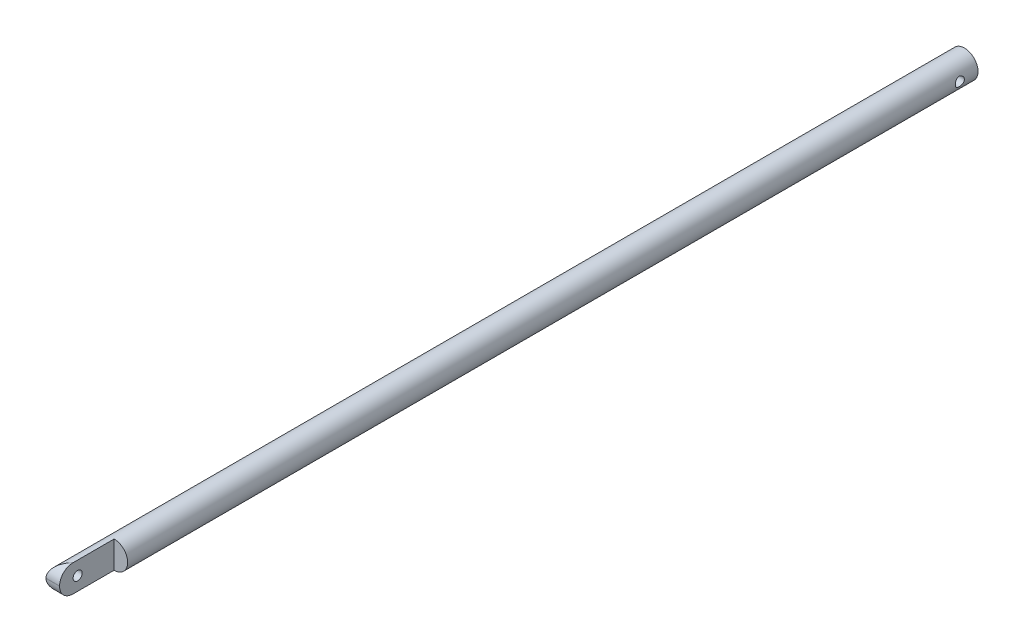
ISO-10303-21;
HEADER;
FILE_DESCRIPTION(('STEP AP214'),'2;1');
FILE_NAME('part.step','',(''),(''),'','','');
FILE_SCHEMA(('AUTOMOTIVE_DESIGN { 1 0 10303 214 1 1 1 1 }'));
ENDSEC;
DATA;
#1=APPLICATION_CONTEXT('core data for automotive mechanical design processes');
#2=APPLICATION_PROTOCOL_DEFINITION('international standard','automotive_design',2000,#1);
#3=PRODUCT_CONTEXT('',#1,'mechanical');
#4=PRODUCT('Part','Part','',(#3));
#5=PRODUCT_RELATED_PRODUCT_CATEGORY('part','',(#4));
#6=PRODUCT_DEFINITION_FORMATION('','',#4);
#7=PRODUCT_DEFINITION_CONTEXT('part definition',#1,'design');
#8=PRODUCT_DEFINITION('design','',#6,#7);
#9=PRODUCT_DEFINITION_SHAPE('','',#8);
#10=(LENGTH_UNIT() NAMED_UNIT(*) SI_UNIT(.MILLI.,.METRE.));
#11=(NAMED_UNIT(*) PLANE_ANGLE_UNIT() SI_UNIT($,.RADIAN.));
#12=(NAMED_UNIT(*) SI_UNIT($,.STERADIAN.) SOLID_ANGLE_UNIT());
#13=UNCERTAINTY_MEASURE_WITH_UNIT(LENGTH_MEASURE(1.E-05),#10,'distance_accuracy_value','');
#14=(GEOMETRIC_REPRESENTATION_CONTEXT(3) GLOBAL_UNCERTAINTY_ASSIGNED_CONTEXT((#13)) GLOBAL_UNIT_ASSIGNED_CONTEXT((#10,
#11,#12)) REPRESENTATION_CONTEXT('',''));
#15=CARTESIAN_POINT('',(0.,0.,0.));
#16=DIRECTION('',(0.,0.,1.));
#17=DIRECTION('',(1.,0.,0.));
#18=AXIS2_PLACEMENT_3D('',#15,#16,#17);
#19=CARTESIAN_POINT('',(0.,0.,100.));
#20=DIRECTION('',(0.,0.,-1.));
#21=DIRECTION('',(-1.,0.,0.));
#22=AXIS2_PLACEMENT_3D('',#19,#20,#21);
#23=CYLINDRICAL_SURFACE('',#22,1.49);
#24=DIRECTION('',(0.,0.,1.));
#25=VECTOR('',#24,1.);
#26=CARTESIAN_POINT('',(0.,-1.49,100.));
#27=LINE('',#26,#25);
#28=CARTESIAN_POINT('',(0.,-1.49,94.));
#29=VERTEX_POINT('',#28);
#30=CARTESIAN_POINT('',(0.,-1.49,98.52));
#31=VERTEX_POINT('',#30);
#32=EDGE_CURVE('E105',#29,#31,#27,.T.);
#33=ORIENTED_EDGE('',*,*,#32,.T.);
#34=CARTESIAN_POINT('',(-1.48996644257513,-0.00999999999999985,100.));
#35=CARTESIAN_POINT('',(-1.48975098299897,-0.0433436972343967,100.000008302624));
#36=CARTESIAN_POINT('',(-1.48839991396683,-0.0766731342420869,99.9988734636431));
#37=CARTESIAN_POINT('',(-1.48349288609919,-0.142992967281033,99.9943846454721));
#38=CARTESIAN_POINT('',(-1.4799386835771,-0.175983612118146,99.9910324338034));
#39=CARTESIAN_POINT('',(-1.47073060528688,-0.241090495511034,99.9822135868565));
#40=CARTESIAN_POINT('',(-1.46509489654836,-0.273211792065162,99.9767652297221));
#41=CARTESIAN_POINT('',(-1.45183776552271,-0.336627404318265,99.9638708596404));
#42=CARTESIAN_POINT('',(-1.44421605115293,-0.367921597628563,99.9564245528493));
#43=CARTESIAN_POINT('',(-1.4186212850257,-0.460062860291223,99.9313384769267));
#44=CARTESIAN_POINT('',(-1.39788132053261,-0.519421624716527,99.9109157406564));
#45=CARTESIAN_POINT('',(-1.35024952062673,-0.633043979274914,99.863882559712));
#46=CARTESIAN_POINT('',(-1.32334373403256,-0.68729561484362,99.8372580802966));
#47=CARTESIAN_POINT('',(-1.25250196174258,-0.811373950170656,99.7670596203769));
#48=CARTESIAN_POINT('',(-1.20611618327293,-0.878411218186854,99.7210213576058));
#49=CARTESIAN_POINT('',(-1.10638789231064,-1.00114324966523,99.6219457019274));
#50=CARTESIAN_POINT('',(-1.05303214725023,-1.05681590858126,99.5688949934698));
#51=CARTESIAN_POINT('',(-0.919924202873167,-1.17672030328409,99.4364786217357));
#52=CARTESIAN_POINT('',(-0.83793177575015,-1.23596314070041,99.3548587504978));
#53=CARTESIAN_POINT('',(-0.668399855263155,-1.33529434396866,99.1860360763111));
#54=CARTESIAN_POINT('',(-0.580854087858026,-1.37536059176952,99.0988269575602));
#55=CARTESIAN_POINT('',(-0.412246912463118,-1.43431082096782,98.9308375242697));
#56=CARTESIAN_POINT('',(-0.331492440316898,-1.4550009898949,98.8503662377716));
#57=CARTESIAN_POINT('',(-0.168957227139915,-1.48267669503932,98.6883891900097));
#58=CARTESIAN_POINT('',(-0.0871789336040764,-1.48969028167084,98.6068858918951));
#59=CARTESIAN_POINT('',(-0.00364537734931286,-1.48999665143288,98.5236331239359));
#60=CARTESIAN_POINT('',(-0.00182266821275024,-1.48999999564511,98.5218165415699));
#61=CARTESIAN_POINT('',(0.,-1.49,98.52));
#62=B_SPLINE_CURVE_WITH_KNOTS('',3,(#34,#35,#36,#37,#38,#39,#40,#41,#42,#43,#44,#45,#46,#47,#48,
#49,#50,#51,#52,#53,#54,#55,#56,#57,#58,#59,#60,#61),.UNSPECIFIED.,.F.,.F.,(4,2,2,2,2,2,2,2,2,2,
2,2,2,4),(0.,0.0999840628176792,0.199888521782604,0.298940878498051,0.398007811113156,
0.595377356559186,0.79319797106562,1.07250348405052,1.35234718525515,1.74019184185946,
2.12848276228958,2.47527570196086,2.82135662458945,2.82907673473602),.UNSPECIFIED.);
#63=CARTESIAN_POINT('',(-1.48996644257513,-0.0100000000000002,100.));
#64=VERTEX_POINT('',#63);
#65=EDGE_CURVE('E57',#31,#64,#62,.F.);
#66=ORIENTED_EDGE('',*,*,#65,.T.);
#67=CARTESIAN_POINT('',(0.,0.,100.));
#68=DIRECTION('',(0.,0.,1.));
#69=DIRECTION('',(1.,0.,0.));
#70=AXIS2_PLACEMENT_3D('',#67,#68,#69);
#71=CIRCLE('',#70,1.49);
#72=CARTESIAN_POINT('',(-1.48996644257513,0.00999999999999733,100.));
#73=VERTEX_POINT('',#72);
#74=EDGE_CURVE('E96',#73,#64,#71,.T.);
#75=ORIENTED_EDGE('',*,*,#74,.F.);
#76=CARTESIAN_POINT('',(-1.48996644257513,0.00999999999999769,100.));
#77=CARTESIAN_POINT('',(-1.48975098299897,0.0433436972343947,100.000008302624));
#78=CARTESIAN_POINT('',(-1.48839991396683,0.076673134242085,99.9988734636431));
#79=CARTESIAN_POINT('',(-1.48349288609919,0.142992967281031,99.9943846454721));
#80=CARTESIAN_POINT('',(-1.4799386835771,0.175983612118144,99.9910324338034));
#81=CARTESIAN_POINT('',(-1.47073060528688,0.241090495511032,99.9822135868565));
#82=CARTESIAN_POINT('',(-1.46509489654836,0.273211792065161,99.9767652297221));
#83=CARTESIAN_POINT('',(-1.45183776552271,0.336627404318263,99.9638708596404));
#84=CARTESIAN_POINT('',(-1.44421605115293,0.367921597628561,99.9564245528493));
#85=CARTESIAN_POINT('',(-1.4186212850257,0.46006286029122,99.9313384769267));
#86=CARTESIAN_POINT('',(-1.39788132053261,0.519421624716526,99.9109157406564));
#87=CARTESIAN_POINT('',(-1.35024952062673,0.633043979274912,99.863882559712));
#88=CARTESIAN_POINT('',(-1.32334373403256,0.687295614843617,99.8372580802966));
#89=CARTESIAN_POINT('',(-1.25250196174258,0.811373950170654,99.7670596203769));
#90=CARTESIAN_POINT('',(-1.20611618327292,0.878411218186857,99.7210213576058));
#91=CARTESIAN_POINT('',(-1.10638789231064,1.00114324966523,99.6219457019274));
#92=CARTESIAN_POINT('',(-1.05303214725025,1.05681590858126,99.5688949934698));
#93=CARTESIAN_POINT('',(-0.919924202873138,1.17672030328409,99.4364786217357));
#94=CARTESIAN_POINT('',(-0.837931775750019,1.23596314070042,99.3548587504979));
#95=CARTESIAN_POINT('',(-0.668399855263281,1.33529434396866,99.1860360763109));
#96=CARTESIAN_POINT('',(-0.580854087858513,1.37536059176952,99.0988269575597));
#97=CARTESIAN_POINT('',(-0.412246912462684,1.43431082096782,98.9308375242701));
#98=CARTESIAN_POINT('',(-0.331492440315354,1.4550009898949,98.8503662377731));
#99=CARTESIAN_POINT('',(-0.168957227141483,1.48267669503932,98.6883891900082));
#100=CARTESIAN_POINT('',(-0.0871789336098552,1.48969028167084,98.6068858918893));
#101=CARTESIAN_POINT('',(-0.00364537734957831,1.48999665143288,98.5236331239357));
#102=CARTESIAN_POINT('',(-0.00182266821288542,1.48999999564511,98.5218165415698));
#103=CARTESIAN_POINT('',(0.,1.49,98.52));
#104=B_SPLINE_CURVE_WITH_KNOTS('',3,(#76,#77,#78,#79,#80,#81,#82,#83,#84,#85,#86,#87,#88,#89,
#90,#91,#92,#93,#94,#95,#96,#97,#98,#99,#100,#101,#102,#103),.UNSPECIFIED.,.F.,.F.,(4,2,2,2,2,2,
2,2,2,2,2,2,2,4),(0.,0.0999840628176796,0.199888521782604,0.298940878498051,0.398007811113156,
0.595377356559186,0.793197971065625,1.07250348405053,1.35234718525516,1.74019184185947,
2.12848276228959,2.47527570196085,2.82135662458943,2.82907673473602),.UNSPECIFIED.);
#105=CARTESIAN_POINT('',(0.,1.49,98.52));
#106=VERTEX_POINT('',#105);
#107=EDGE_CURVE('E166',#73,#106,#104,.T.);
#108=ORIENTED_EDGE('',*,*,#107,.T.);
#109=DIRECTION('',(0.,0.,1.));
#110=VECTOR('',#109,1.);
#111=CARTESIAN_POINT('',(0.,1.49,100.));
#112=LINE('',#111,#110);
#113=CARTESIAN_POINT('',(0.,1.49,94.));
#114=VERTEX_POINT('',#113);
#115=EDGE_CURVE('E111',#114,#106,#112,.T.);
#116=ORIENTED_EDGE('',*,*,#115,.F.);
#117=CARTESIAN_POINT('',(0.,0.,94.));
#118=DIRECTION('',(0.,0.,-1.));
#119=DIRECTION('',(-1.,0.,0.));
#120=AXIS2_PLACEMENT_3D('',#117,#118,#119);
#121=CIRCLE('',#120,1.49);
#122=EDGE_CURVE('E11',#114,#29,#121,.T.);
#123=ORIENTED_EDGE('',*,*,#122,.T.);
#124=EDGE_LOOP('',(#33,#66,#75,#108,#116,#123));
#125=FACE_BOUND('',#124,.T.);
#126=CARTESIAN_POINT('',(-1.49,0.,2.));
#127=CARTESIAN_POINT('',(-1.49000010328991,0.0272712791740718,1.99999983628463));
#128=CARTESIAN_POINT('',(-1.48924440153776,0.0545414979399945,2.00223841327082));
#129=CARTESIAN_POINT('',(-1.48630425140027,0.108278077470845,2.01110572681788));
#130=CARTESIAN_POINT('',(-1.48411967368715,0.134744365244943,2.01773486076933));
#131=CARTESIAN_POINT('',(-1.47855899787541,0.186090621253429,2.03513003136166));
#132=CARTESIAN_POINT('',(-1.47518490842495,0.21097318071568,2.04588909676971));
#133=CARTESIAN_POINT('',(-1.4675891719475,0.258580556650836,2.07120700818237));
#134=CARTESIAN_POINT('',(-1.46336735426352,0.28130493729976,2.08576661945578));
#135=CARTESIAN_POINT('',(-1.45435457808162,0.324747230286621,2.11880802865111));
#136=CARTESIAN_POINT('',(-1.44954985403106,0.345379087084158,2.13739919369083));
#137=CARTESIAN_POINT('',(-1.43998809693041,0.383298091304435,2.17774347094495));
#138=CARTESIAN_POINT('',(-1.43523107479877,0.400584488841864,2.19949729015968));
#139=CARTESIAN_POINT('',(-1.42615143086999,0.431815906482383,2.24632744983905));
#140=CARTESIAN_POINT('',(-1.4218455576492,0.445648570057964,2.27148228296438));
#141=CARTESIAN_POINT('',(-1.4143652892813,0.468850217401379,2.32392907639742));
#142=CARTESIAN_POINT('',(-1.41119054360571,0.478220584307141,2.35122037142728));
#143=CARTESIAN_POINT('',(-1.40647705001541,0.491907942067121,2.40618611263394));
#144=CARTESIAN_POINT('',(-1.40488620898134,0.496386348448487,2.43381576315859));
#145=CARTESIAN_POINT('',(-1.40336664138944,0.500667279377964,2.48947658681981));
#146=CARTESIAN_POINT('',(-1.40343739299196,0.500471271971788,2.51750763113078));
#147=CARTESIAN_POINT('',(-1.40518740435821,0.495534169464834,2.57179402936628));
#148=CARTESIAN_POINT('',(-1.40679188491689,0.491004366111104,2.5980714296447));
#149=CARTESIAN_POINT('',(-1.41130610896407,0.47787317957604,2.64946907516433));
#150=CARTESIAN_POINT('',(-1.41421601070032,0.469271302756649,2.67458917970684));
#151=CARTESIAN_POINT('',(-1.4210660539239,0.448103006348791,2.72343665940683));
#152=CARTESIAN_POINT('',(-1.42502217997329,0.435474388837752,2.7471347421311));
#153=CARTESIAN_POINT('',(-1.43351228961077,0.406654274709062,2.79214191626118));
#154=CARTESIAN_POINT('',(-1.43804644174384,0.390461737893833,2.81345030744349));
#155=CARTESIAN_POINT('',(-1.44747526028931,0.353961109207902,2.85425965787299));
#156=CARTESIAN_POINT('',(-1.45237630268226,0.333480480967077,2.87360514279225));
#157=CARTESIAN_POINT('',(-1.46177681515474,0.289505558754766,2.90862781120439));
#158=CARTESIAN_POINT('',(-1.46627624564835,0.266010968259399,2.92430463333256));
#159=CARTESIAN_POINT('',(-1.47442702746644,0.216341917244808,2.95167240326501));
#160=CARTESIAN_POINT('',(-1.47806928618575,0.190142627150065,2.96332118289617));
#161=CARTESIAN_POINT('',(-1.48402926963735,0.136004803872141,2.98199773351539));
#162=CARTESIAN_POINT('',(-1.4863474609046,0.108066887146301,2.98902713227315));
#163=CARTESIAN_POINT('',(-1.48932058461056,0.0525606780569667,2.99798875430522));
#164=CARTESIAN_POINT('',(-1.4900440111033,0.0250299224410379,3.00013102652991));
#165=CARTESIAN_POINT('',(-1.4899518385133,-0.0300034936362861,2.99985660523771));
#166=CARTESIAN_POINT('',(-1.48913650317494,-0.0575061581041101,2.99744069299542));
#167=CARTESIAN_POINT('',(-1.48610363699289,-0.110858597983628,2.98828438913505));
#168=CARTESIAN_POINT('',(-1.48392808093254,-0.136733197224387,2.98167336554805));
#169=CARTESIAN_POINT('',(-1.47843582505159,-0.186995220974407,2.96447668139141));
#170=CARTESIAN_POINT('',(-1.4751189793498,-0.211382454897262,2.95389051269754));
#171=CARTESIAN_POINT('',(-1.46757108431293,-0.258697971137434,2.92873335415114));
#172=CARTESIAN_POINT('',(-1.46331813987176,-0.281570472885884,2.91406421011183));
#173=CARTESIAN_POINT('',(-1.45437968596127,-0.324597323735366,2.881272575541));
#174=CARTESIAN_POINT('',(-1.44969404304575,-0.344750829537892,2.86314901780648));
#175=CARTESIAN_POINT('',(-1.44014437423253,-0.382734388178813,2.82297545272353));
#176=CARTESIAN_POINT('',(-1.43528207821155,-0.400414575970997,2.80078299372242));
#177=CARTESIAN_POINT('',(-1.42614890345811,-0.431819007339464,2.75364217057607));
#178=CARTESIAN_POINT('',(-1.42187803153918,-0.445543205342555,2.72869377468689));
#179=CARTESIAN_POINT('',(-1.41445213053474,-0.468585455710087,2.67673044131429));
#180=CARTESIAN_POINT('',(-1.41129511890296,-0.477911346635394,2.64971928066767));
#181=CARTESIAN_POINT('',(-1.40650261472902,-0.49183910433744,2.59437919045322));
#182=CARTESIAN_POINT('',(-1.40486642452427,-0.496443137322599,2.56605087138826));
#183=CARTESIAN_POINT('',(-1.40338086715801,-0.500626163459951,2.51046706191328));
#184=CARTESIAN_POINT('',(-1.40344292885304,-0.500454236044088,2.48323247766306));
#185=CARTESIAN_POINT('',(-1.40512747904943,-0.495704521019355,2.4292019426707));
#186=CARTESIAN_POINT('',(-1.40674987227537,-0.491127002420299,2.40240596524838));
#187=CARTESIAN_POINT('',(-1.41130590786776,-0.477873344634468,2.35053414693942));
#188=CARTESIAN_POINT('',(-1.41421334761914,-0.469278920001822,2.32543494453842));
#189=CARTESIAN_POINT('',(-1.42100189547432,-0.448301880528059,2.2770157193149));
#190=CARTESIAN_POINT('',(-1.42488322148709,-0.435918417745902,2.25369609620173));
#191=CARTESIAN_POINT('',(-1.43339567974663,-0.407077481819681,2.2083826669073));
#192=CARTESIAN_POINT('',(-1.43805233764558,-0.390464372395735,2.18649274492217));
#193=CARTESIAN_POINT('',(-1.44748489716174,-0.35389768082118,2.14573099470454));
#194=CARTESIAN_POINT('',(-1.45226083237488,-0.33394314827934,2.12686002813918));
#195=CARTESIAN_POINT('',(-1.46162145441099,-0.290308968608991,2.09191628284473));
#196=CARTESIAN_POINT('',(-1.4661910212257,-0.266512884032293,2.07598433559481));
#197=CARTESIAN_POINT('',(-1.47441552151367,-0.216429308719879,2.04836342823734));
#198=CARTESIAN_POINT('',(-1.47807067427932,-0.190142417411912,2.03667345052813));
#199=CARTESIAN_POINT('',(-1.4839284145504,-0.136909000046836,2.01831929380489));
#200=CARTESIAN_POINT('',(-1.48618353400992,-0.110031581411885,2.01147180798678));
#201=CARTESIAN_POINT('',(-1.48921906370376,-0.0554355817398468,2.00231289188839));
#202=CARTESIAN_POINT('',(-1.48999989502101,-0.0277172431833341,2.00000016639259));
#203=CARTESIAN_POINT('',(-1.49,0.,2.));
#204=B_SPLINE_CURVE_WITH_KNOTS('',3,(#126,#127,#128,#129,#130,#131,#132,#133,#134,#135,#136,
#137,#138,#139,#140,#141,#142,#143,#144,#145,#146,#147,#148,#149,#150,#151,#152,#153,#154,#155,
#156,#157,#158,#159,#160,#161,#162,#163,#164,#165,#166,#167,#168,#169,#170,#171,#172,#173,#174,
#175,#176,#177,#178,#179,#180,#181,#182,#183,#184,#185,#186,#187,#188,#189,#190,#191,#192,#193,
#194,#195,#196,#197,#198,#199,#200,#201,#202,#203),.UNSPECIFIED.,.T.,.F.,(4,2,2,2,2,2,2,2,2,2,2,
2,2,2,2,2,2,2,2,2,2,2,2,2,2,2,2,2,2,2,2,2,2,2,2,2,2,2,4),(0.,0.0817118272235162,
0.163431051219379,0.245012937283682,0.326611263169847,0.410787135766958,0.49498185460364,
0.581636011888748,0.668263292254159,0.751936751908595,0.835583933434636,0.915350294839791,
0.995126328417926,1.07619970837021,1.15729678258258,1.24268851392295,1.32808865284519,
1.41435751739667,1.5005959663462,1.58305181820848,1.66549353838933,1.74550888576446,
1.8255344646112,1.90768050072293,1.9898519562014,2.07581001104021,2.16176905608036,
2.24757432254128,2.33334020718494,2.41464198948884,2.49593880773932,2.5756493715034,
2.65537778659323,2.73862371972265,2.82189337059319,2.90846884754177,2.99502354223821,
3.07809532369764,3.16114337478657),.UNSPECIFIED.);
#205=CARTESIAN_POINT('',(-1.49,0.,2.));
#206=VERTEX_POINT('',#205);
#207=EDGE_CURVE('E50',#206,#206,#204,.T.);
#208=ORIENTED_EDGE('',*,*,#207,.T.);
#209=EDGE_LOOP('',(#208));
#210=FACE_BOUND('',#209,.T.);
#211=CARTESIAN_POINT('',(1.49,0.,2.));
#212=CARTESIAN_POINT('',(1.49000010328991,-0.0272712791740726,1.99999983628462));
#213=CARTESIAN_POINT('',(1.48924440153776,-0.0545414979399952,2.00223841327082));
#214=CARTESIAN_POINT('',(1.48630425140027,-0.108278077470846,2.01110572681788));
#215=CARTESIAN_POINT('',(1.48411967368715,-0.134744365244944,2.01773486076933));
#216=CARTESIAN_POINT('',(1.47855899787541,-0.186090621253429,2.03513003136166));
#217=CARTESIAN_POINT('',(1.47518490842495,-0.210973180715681,2.04588909676971));
#218=CARTESIAN_POINT('',(1.4675891719475,-0.258580556650837,2.07120700818237));
#219=CARTESIAN_POINT('',(1.46336735426352,-0.281304937299761,2.08576661945578));
#220=CARTESIAN_POINT('',(1.45435457808162,-0.324747230286622,2.11880802865111));
#221=CARTESIAN_POINT('',(1.44954985403106,-0.345379087084159,2.13739919369083));
#222=CARTESIAN_POINT('',(1.43998809693041,-0.383298091304436,2.17774347094495));
#223=CARTESIAN_POINT('',(1.43523107479877,-0.400584488841865,2.19949729015968));
#224=CARTESIAN_POINT('',(1.42615143086999,-0.431815906482384,2.24632744983905));
#225=CARTESIAN_POINT('',(1.4218455576492,-0.445648570057965,2.27148228296438));
#226=CARTESIAN_POINT('',(1.4143652892813,-0.46885021740138,2.32392907639742));
#227=CARTESIAN_POINT('',(1.41119054360571,-0.478220584307142,2.35122037142728));
#228=CARTESIAN_POINT('',(1.40647705001541,-0.491907942067123,2.40618611263394));
#229=CARTESIAN_POINT('',(1.40488620898134,-0.496386348448489,2.43381576315859));
#230=CARTESIAN_POINT('',(1.40336664138944,-0.500667279377965,2.48947658681981));
#231=CARTESIAN_POINT('',(1.40343739299196,-0.50047127197179,2.51750763113078));
#232=CARTESIAN_POINT('',(1.4051874043582,-0.495534169464836,2.57179402936628));
#233=CARTESIAN_POINT('',(1.40679188491689,-0.491004366111105,2.5980714296447));
#234=CARTESIAN_POINT('',(1.41130610896407,-0.477873179576042,2.64946907516433));
#235=CARTESIAN_POINT('',(1.41421601070032,-0.469271302756651,2.67458917970684));
#236=CARTESIAN_POINT('',(1.4210660539239,-0.448103006348793,2.72343665940683));
#237=CARTESIAN_POINT('',(1.42502217997329,-0.435474388837754,2.7471347421311));
#238=CARTESIAN_POINT('',(1.43351228961077,-0.406654274709064,2.79214191626118));
#239=CARTESIAN_POINT('',(1.43804644174384,-0.390461737893835,2.81345030744349));
#240=CARTESIAN_POINT('',(1.44747526028931,-0.353961109207904,2.85425965787299));
#241=CARTESIAN_POINT('',(1.45237630268226,-0.33348048096708,2.87360514279225));
#242=CARTESIAN_POINT('',(1.46177681515474,-0.289505558754769,2.90862781120439));
#243=CARTESIAN_POINT('',(1.46627624564835,-0.266010968259402,2.92430463333256));
#244=CARTESIAN_POINT('',(1.47442702746644,-0.21634191724481,2.95167240326501));
#245=CARTESIAN_POINT('',(1.47806928618575,-0.190142627150068,2.96332118289617));
#246=CARTESIAN_POINT('',(1.48402926963735,-0.136004803872143,2.98199773351539));
#247=CARTESIAN_POINT('',(1.4863474609046,-0.108066887146304,2.98902713227315));
#248=CARTESIAN_POINT('',(1.48932058461056,-0.0525606780569693,2.99798875430522));
#249=CARTESIAN_POINT('',(1.4900440111033,-0.0250299224410405,3.00013102652991));
#250=CARTESIAN_POINT('',(1.4899518385133,0.0300034936362835,2.99985660523771));
#251=CARTESIAN_POINT('',(1.48913650317494,0.0575061581041077,2.99744069299542));
#252=CARTESIAN_POINT('',(1.48610363699289,0.110858597983625,2.98828438913505));
#253=CARTESIAN_POINT('',(1.48392808093254,0.136733197224384,2.98167336554805));
#254=CARTESIAN_POINT('',(1.47843582505159,0.186995220974404,2.96447668139141));
#255=CARTESIAN_POINT('',(1.4751189793498,0.21138245489726,2.95389051269754));
#256=CARTESIAN_POINT('',(1.46757108431293,0.258697971137432,2.92873335415114));
#257=CARTESIAN_POINT('',(1.46331813987177,0.281570472885882,2.91406421011183));
#258=CARTESIAN_POINT('',(1.45437968596127,0.324597323735363,2.881272575541));
#259=CARTESIAN_POINT('',(1.44969404304575,0.34475082953789,2.86314901780648));
#260=CARTESIAN_POINT('',(1.44014437423253,0.382734388178811,2.82297545272353));
#261=CARTESIAN_POINT('',(1.43528207821155,0.400414575970995,2.80078299372242));
#262=CARTESIAN_POINT('',(1.42614890345811,0.431819007339461,2.75364217057607));
#263=CARTESIAN_POINT('',(1.42187803153918,0.445543205342553,2.72869377468689));
#264=CARTESIAN_POINT('',(1.41445213053474,0.468585455710085,2.67673044131429));
#265=CARTESIAN_POINT('',(1.41129511890296,0.477911346635392,2.64971928066767));
#266=CARTESIAN_POINT('',(1.40650261472902,0.491839104337439,2.59437919045322));
#267=CARTESIAN_POINT('',(1.40486642452427,0.496443137322597,2.56605087138826));
#268=CARTESIAN_POINT('',(1.40338086715801,0.50062616345995,2.51046706191328));
#269=CARTESIAN_POINT('',(1.40344292885304,0.500454236044087,2.48323247766306));
#270=CARTESIAN_POINT('',(1.40512747904943,0.495704521019353,2.4292019426707));
#271=CARTESIAN_POINT('',(1.40674987227537,0.491127002420298,2.40240596524838));
#272=CARTESIAN_POINT('',(1.41130590786776,0.477873344634466,2.35053414693942));
#273=CARTESIAN_POINT('',(1.41421334761914,0.46927892000182,2.32543494453842));
#274=CARTESIAN_POINT('',(1.42100189547432,0.448301880528058,2.2770157193149));
#275=CARTESIAN_POINT('',(1.42488322148709,0.435918417745901,2.25369609620173));
#276=CARTESIAN_POINT('',(1.43339567974663,0.40707748181968,2.2083826669073));
#277=CARTESIAN_POINT('',(1.43805233764558,0.390464372395734,2.18649274492217));
#278=CARTESIAN_POINT('',(1.44748489716174,0.353897680821179,2.14573099470454));
#279=CARTESIAN_POINT('',(1.45226083237488,0.333943148279339,2.12686002813918));
#280=CARTESIAN_POINT('',(1.46162145441099,0.29030896860899,2.09191628284473));
#281=CARTESIAN_POINT('',(1.4661910212257,0.266512884032292,2.07598433559481));
#282=CARTESIAN_POINT('',(1.47441552151367,0.216429308719878,2.04836342823734));
#283=CARTESIAN_POINT('',(1.47807067427932,0.190142417411911,2.03667345052813));
#284=CARTESIAN_POINT('',(1.4839284145504,0.136909000046836,2.01831929380489));
#285=CARTESIAN_POINT('',(1.48618353400992,0.110031581411884,2.01147180798678));
#286=CARTESIAN_POINT('',(1.48921906370376,0.0554355817398463,2.00231289188839));
#287=CARTESIAN_POINT('',(1.48999989502101,0.0277172431833335,2.00000016639259));
#288=CARTESIAN_POINT('',(1.49,0.,2.));
#289=B_SPLINE_CURVE_WITH_KNOTS('',3,(#211,#212,#213,#214,#215,#216,#217,#218,#219,#220,#221,
#222,#223,#224,#225,#226,#227,#228,#229,#230,#231,#232,#233,#234,#235,#236,#237,#238,#239,#240,
#241,#242,#243,#244,#245,#246,#247,#248,#249,#250,#251,#252,#253,#254,#255,#256,#257,#258,#259,
#260,#261,#262,#263,#264,#265,#266,#267,#268,#269,#270,#271,#272,#273,#274,#275,#276,#277,#278,
#279,#280,#281,#282,#283,#284,#285,#286,#287,#288),.UNSPECIFIED.,.T.,.F.,(4,2,2,2,2,2,2,2,2,2,2,
2,2,2,2,2,2,2,2,2,2,2,2,2,2,2,2,2,2,2,2,2,2,2,2,2,2,2,4),(0.,0.0817118272235161,
0.163431051219379,0.245012937283682,0.326611263169847,0.410787135766957,0.49498185460364,
0.581636011888748,0.668263292254159,0.751936751908595,0.835583933434637,0.915350294839792,
0.995126328417926,1.07619970837021,1.15729678258258,1.24268851392295,1.32808865284519,
1.41435751739667,1.5005959663462,1.58305181820848,1.66549353838933,1.74550888576446,
1.8255344646112,1.90768050072293,1.9898519562014,2.07581001104021,2.16176905608036,
2.24757432254128,2.33334020718494,2.41464198948884,2.49593880773932,2.5756493715034,
2.65537778659323,2.73862371972265,2.82189337059319,2.90846884754177,2.99502354223821,
3.07809532369764,3.16114337478657),.UNSPECIFIED.);
#290=CARTESIAN_POINT('',(1.49,0.,2.));
#291=VERTEX_POINT('',#290);
#292=EDGE_CURVE('E116',#291,#291,#289,.T.);
#293=ORIENTED_EDGE('',*,*,#292,.T.);
#294=EDGE_LOOP('',(#293));
#295=FACE_BOUND('',#294,.T.);
#296=CARTESIAN_POINT('',(-1.49,0.,98.51));
#297=CARTESIAN_POINT('',(-1.49000010328991,-0.0272712791740732,98.5100001637154));
#298=CARTESIAN_POINT('',(-1.48924440153776,-0.0545414979399963,98.5077615867292));
#299=CARTESIAN_POINT('',(-1.48630425140027,-0.108278077470847,98.4988942731821));
#300=CARTESIAN_POINT('',(-1.48411967368715,-0.134744365244945,98.4922651392307));
#301=CARTESIAN_POINT('',(-1.47855899787541,-0.186090621253428,98.4748699686383));
#302=CARTESIAN_POINT('',(-1.47518490842495,-0.210973180715678,98.4641109032303));
#303=CARTESIAN_POINT('',(-1.4675891719475,-0.258580556650835,98.4387929918176));
#304=CARTESIAN_POINT('',(-1.46336735426352,-0.281304937299761,98.4242333805442));
#305=CARTESIAN_POINT('',(-1.45435457808162,-0.324747230286625,98.3911919713489));
#306=CARTESIAN_POINT('',(-1.44954985403106,-0.345379087084163,98.3726008063092));
#307=CARTESIAN_POINT('',(-1.43998809693041,-0.38329809130444,98.332256529055));
#308=CARTESIAN_POINT('',(-1.43523107479876,-0.400584488841867,98.3105027098403));
#309=CARTESIAN_POINT('',(-1.42615143086999,-0.431815906482383,98.2636725501609));
#310=CARTESIAN_POINT('',(-1.4218455576492,-0.445648570057963,98.2385177170356));
#311=CARTESIAN_POINT('',(-1.4143652892813,-0.468850217401379,98.1860709236026));
#312=CARTESIAN_POINT('',(-1.41119054360571,-0.478220584307141,98.1587796285727));
#313=CARTESIAN_POINT('',(-1.40647705001541,-0.491907942067123,98.1038138873661));
#314=CARTESIAN_POINT('',(-1.40488620898134,-0.496386348448489,98.0761842368414));
#315=CARTESIAN_POINT('',(-1.40336664138944,-0.500667279377964,98.0205234131802));
#316=CARTESIAN_POINT('',(-1.40343739299196,-0.500471271971788,97.9924923688692));
#317=CARTESIAN_POINT('',(-1.40518740435821,-0.495534169464833,97.9382059706337));
#318=CARTESIAN_POINT('',(-1.40679188491689,-0.491004366111102,97.9119285703553));
#319=CARTESIAN_POINT('',(-1.41130610896407,-0.477873179576038,97.8605309248357));
#320=CARTESIAN_POINT('',(-1.41421601070032,-0.469271302756647,97.8354108202931));
#321=CARTESIAN_POINT('',(-1.4210660539239,-0.448103006348788,97.7865633405932));
#322=CARTESIAN_POINT('',(-1.42502217997329,-0.435474388837748,97.7628652578689));
#323=CARTESIAN_POINT('',(-1.43351228961077,-0.406654274709056,97.7178580837388));
#324=CARTESIAN_POINT('',(-1.43804644174384,-0.390461737893826,97.6965496925565));
#325=CARTESIAN_POINT('',(-1.44747526028931,-0.353961109207895,97.655740342127));
#326=CARTESIAN_POINT('',(-1.45237630268227,-0.333480480967072,97.6363948572077));
#327=CARTESIAN_POINT('',(-1.46177681515474,-0.289505558754763,97.6013721887956));
#328=CARTESIAN_POINT('',(-1.46627624564835,-0.266010968259398,97.5856953666675));
#329=CARTESIAN_POINT('',(-1.47442702746644,-0.216341917244808,97.558327596735));
#330=CARTESIAN_POINT('',(-1.47806928618575,-0.190142627150066,97.5466788171038));
#331=CARTESIAN_POINT('',(-1.48402926963735,-0.136004803872141,97.5280022664846));
#332=CARTESIAN_POINT('',(-1.4863474609046,-0.108066887146299,97.5209728677269));
#333=CARTESIAN_POINT('',(-1.48932058461056,-0.0525606780569623,97.5120112456948));
#334=CARTESIAN_POINT('',(-1.4900440111033,-0.0250299224410335,97.5098689734701));
#335=CARTESIAN_POINT('',(-1.4899518385133,0.0300034936362907,97.5101433947623));
#336=CARTESIAN_POINT('',(-1.48913650317494,0.0575061581041149,97.5125593070046));
#337=CARTESIAN_POINT('',(-1.48610363699289,0.110858597983631,97.5217156108649));
#338=CARTESIAN_POINT('',(-1.48392808093254,0.13673319722439,97.5283266344519));
#339=CARTESIAN_POINT('',(-1.47843582505159,0.186995220974409,97.5455233186086));
#340=CARTESIAN_POINT('',(-1.4751189793498,0.211382454897264,97.5561094873025));
#341=CARTESIAN_POINT('',(-1.46757108431293,0.258697971137437,97.5812666458489));
#342=CARTESIAN_POINT('',(-1.46331813987176,0.281570472885889,97.5959357898882));
#343=CARTESIAN_POINT('',(-1.45437968596127,0.324597323735369,97.628727424459));
#344=CARTESIAN_POINT('',(-1.44969404304575,0.344750829537892,97.6468509821935));
#345=CARTESIAN_POINT('',(-1.44014437423253,0.382734388178812,97.6870245472765));
#346=CARTESIAN_POINT('',(-1.43528207821155,0.400414575970998,97.7092170062776));
#347=CARTESIAN_POINT('',(-1.42614890345811,0.431819007339466,97.7563578294239));
#348=CARTESIAN_POINT('',(-1.42187803153918,0.445543205342556,97.7813062253131));
#349=CARTESIAN_POINT('',(-1.41445213053474,0.468585455710087,97.8332695586857));
#350=CARTESIAN_POINT('',(-1.41129511890296,0.477911346635395,97.8602807193324));
#351=CARTESIAN_POINT('',(-1.40650261472902,0.491839104337441,97.9156208095468));
#352=CARTESIAN_POINT('',(-1.40486642452427,0.496443137322599,97.9439491286117));
#353=CARTESIAN_POINT('',(-1.40338086715801,0.500626163459951,97.9995329380867));
#354=CARTESIAN_POINT('',(-1.40344292885304,0.500454236044087,98.0267675223369));
#355=CARTESIAN_POINT('',(-1.40512747904943,0.495704521019351,98.0807980573293));
#356=CARTESIAN_POINT('',(-1.40674987227537,0.491127002420295,98.1075940347516));
#357=CARTESIAN_POINT('',(-1.41130590786776,0.477873344634461,98.1594658530606));
#358=CARTESIAN_POINT('',(-1.41421334761915,0.469278920001816,98.1845650554616));
#359=CARTESIAN_POINT('',(-1.42100189547432,0.448301880528053,98.2329842806851));
#360=CARTESIAN_POINT('',(-1.42488322148709,0.435918417745896,98.2563039037983));
#361=CARTESIAN_POINT('',(-1.43339567974663,0.407077481819678,98.3016173330927));
#362=CARTESIAN_POINT('',(-1.43805233764559,0.390464372395733,98.3235072550778));
#363=CARTESIAN_POINT('',(-1.44748489716174,0.353897680821178,98.3642690052955));
#364=CARTESIAN_POINT('',(-1.45226083237488,0.333943148279337,98.3831399718608));
#365=CARTESIAN_POINT('',(-1.46162145441099,0.290308968608987,98.4180837171553));
#366=CARTESIAN_POINT('',(-1.46619102122571,0.266512884032289,98.4340156644052));
#367=CARTESIAN_POINT('',(-1.47441552151367,0.216429308719874,98.4616365717627));
#368=CARTESIAN_POINT('',(-1.47807067427932,0.190142417411907,98.4733265494719));
#369=CARTESIAN_POINT('',(-1.4839284145504,0.136909000046832,98.4916807061951));
#370=CARTESIAN_POINT('',(-1.48618353400992,0.110031581411882,98.4985281920132));
#371=CARTESIAN_POINT('',(-1.48921906370376,0.0554355817398457,98.5076871081116));
#372=CARTESIAN_POINT('',(-1.48999989502101,0.0277172431833331,98.5099998336074));
#373=CARTESIAN_POINT('',(-1.49,0.,98.51));
#374=B_SPLINE_CURVE_WITH_KNOTS('',3,(#296,#297,#298,#299,#300,#301,#302,#303,#304,#305,#306,
#307,#308,#309,#310,#311,#312,#313,#314,#315,#316,#317,#318,#319,#320,#321,#322,#323,#324,#325,
#326,#327,#328,#329,#330,#331,#332,#333,#334,#335,#336,#337,#338,#339,#340,#341,#342,#343,#344,
#345,#346,#347,#348,#349,#350,#351,#352,#353,#354,#355,#356,#357,#358,#359,#360,#361,#362,#363,
#364,#365,#366,#367,#368,#369,#370,#371,#372,#373),.UNSPECIFIED.,.T.,.F.,(4,2,2,2,2,2,2,2,2,2,2,
2,2,2,2,2,2,2,2,2,2,2,2,2,2,2,2,2,2,2,2,2,2,2,2,2,2,2,4),(0.,0.0817118272235174,
0.163431051219382,0.245012937283678,0.326611263169852,0.410787135766959,0.494981854603639,
0.581636011888742,0.668263292254157,0.751936751908619,0.835583933434645,0.915350294839797,
0.995126328417932,1.07619970837022,1.15729678258259,1.24268851392295,1.32808865284519,
1.41435751739667,1.5005959663462,1.58305181820848,1.66549353838933,1.74550888576446,
1.8255344646112,1.90768050072294,1.9898519562014,2.07581001104021,2.16176905608037,
2.2475743225413,2.33334020718494,2.41464198948884,2.49593880773933,2.57564937150341,
2.65537778659322,2.73862371972265,2.82189337059318,2.90846884754177,2.99502354223821,
3.07809532369764,3.16114337478656),.UNSPECIFIED.);
#375=CARTESIAN_POINT('',(-1.49,0.,98.51));
#376=VERTEX_POINT('',#375);
#377=EDGE_CURVE('E151',#376,#376,#374,.T.);
#378=ORIENTED_EDGE('',*,*,#377,.T.);
#379=EDGE_LOOP('',(#378));
#380=FACE_BOUND('',#379,.T.);
#381=CARTESIAN_POINT('',(0.,0.,0.5));
#382=DIRECTION('',(0.,0.,-1.));
#383=DIRECTION('',(-1.,0.,0.));
#384=AXIS2_PLACEMENT_3D('',#381,#382,#383);
#385=CIRCLE('',#384,1.49);
#386=CARTESIAN_POINT('',(-1.49,0.,0.5));
#387=VERTEX_POINT('',#386);
#388=EDGE_CURVE('E154',#387,#387,#385,.T.);
#389=ORIENTED_EDGE('',*,*,#388,.F.);
#390=EDGE_LOOP('',(#389));
#391=FACE_BOUND('',#390,.T.);
#392=ADVANCED_FACE('F41',(#125,#210,#295,#380,#391),#23,.T.);
#393=CARTESIAN_POINT('',(0.,0.,100.));
#394=DIRECTION('',(0.,0.,1.));
#395=DIRECTION('',(1.,0.,0.));
#396=AXIS2_PLACEMENT_3D('',#393,#394,#395);
#397=PLANE('',#396);
#398=DIRECTION('',(1.,0.,0.));
#399=VECTOR('',#398,1.);
#400=CARTESIAN_POINT('',(-10.,-0.0100000000000002,100.));
#401=LINE('',#400,#399);
#402=CARTESIAN_POINT('',(0.,-0.0100000000000002,100.));
#403=VERTEX_POINT('',#402);
#404=EDGE_CURVE('E82',#64,#403,#401,.T.);
#405=ORIENTED_EDGE('',*,*,#404,.T.);
#406=DIRECTION('',(0.,1.,0.));
#407=VECTOR('',#406,1.);
#408=CARTESIAN_POINT('',(0.,-1.49,100.));
#409=LINE('',#408,#407);
#410=CARTESIAN_POINT('',(0.,0.00999999999999751,100.));
#411=VERTEX_POINT('',#410);
#412=EDGE_CURVE('E94',#403,#411,#409,.T.);
#413=ORIENTED_EDGE('',*,*,#412,.T.);
#414=DIRECTION('',(1.,0.,0.));
#415=VECTOR('',#414,1.);
#416=CARTESIAN_POINT('',(-10.,0.00999999999999733,100.));
#417=LINE('',#416,#415);
#418=EDGE_CURVE('E65',#73,#411,#417,.T.);
#419=ORIENTED_EDGE('',*,*,#418,.F.);
#420=ORIENTED_EDGE('',*,*,#74,.T.);
#421=EDGE_LOOP('',(#405,#413,#419,#420));
#422=FACE_BOUND('',#421,.T.);
#423=ADVANCED_FACE('F93',(#422),#397,.T.);
#424=CARTESIAN_POINT('',(0.,-1.49,100.));
#425=DIRECTION('',(-1.,0.,0.));
#426=DIRECTION('',(0.,0.,1.));
#427=AXIS2_PLACEMENT_3D('',#424,#425,#426);
#428=PLANE('',#427);
#429=ORIENTED_EDGE('',*,*,#412,.F.);
#430=CARTESIAN_POINT('',(0.,-0.01,98.52));
#431=DIRECTION('',(1.,0.,0.));
#432=DIRECTION('',(0.,0.,-1.));
#433=AXIS2_PLACEMENT_3D('',#430,#431,#432);
#434=CIRCLE('',#433,1.48);
#435=EDGE_CURVE('E79',#31,#403,#434,.F.);
#436=ORIENTED_EDGE('',*,*,#435,.F.);
#437=ORIENTED_EDGE('',*,*,#32,.F.);
#438=DIRECTION('',(0.,1.,0.));
#439=VECTOR('',#438,1.);
#440=CARTESIAN_POINT('',(0.,-1.49,94.));
#441=LINE('',#440,#439);
#442=EDGE_CURVE('E104',#29,#114,#441,.T.);
#443=ORIENTED_EDGE('',*,*,#442,.T.);
#444=ORIENTED_EDGE('',*,*,#115,.T.);
#445=CARTESIAN_POINT('',(0.,0.00999999999999751,98.52));
#446=DIRECTION('',(1.,0.,0.));
#447=DIRECTION('',(0.,0.,-1.));
#448=AXIS2_PLACEMENT_3D('',#445,#446,#447);
#449=CIRCLE('',#448,1.48);
#450=EDGE_CURVE('E98',#411,#106,#449,.F.);
#451=ORIENTED_EDGE('',*,*,#450,.F.);
#452=EDGE_LOOP('',(#429,#436,#437,#443,#444,#451));
#453=FACE_BOUND('',#452,.T.);
#454=CARTESIAN_POINT('',(0.,0.,98.01));
#455=DIRECTION('',(1.,0.,0.));
#456=DIRECTION('',(0.,0.,-1.));
#457=AXIS2_PLACEMENT_3D('',#454,#455,#456);
#458=CIRCLE('',#457,0.499999999999999);
#459=CARTESIAN_POINT('',(0.,0.,97.51));
#460=VERTEX_POINT('',#459);
#461=EDGE_CURVE('E88',#460,#460,#458,.T.);
#462=ORIENTED_EDGE('',*,*,#461,.F.);
#463=EDGE_LOOP('',(#462));
#464=FACE_BOUND('',#463,.T.);
#465=ADVANCED_FACE('F100',(#453,#464),#428,.F.);
#466=CARTESIAN_POINT('',(-1.49,0.,2.5));
#467=DIRECTION('',(1.,0.,0.));
#468=DIRECTION('',(0.,0.,-1.));
#469=AXIS2_PLACEMENT_3D('',#466,#467,#468);
#470=CYLINDRICAL_SURFACE('',#469,0.5);
#471=ORIENTED_EDGE('',*,*,#292,.F.);
#472=EDGE_LOOP('',(#471));
#473=FACE_BOUND('',#472,.T.);
#474=ORIENTED_EDGE('',*,*,#207,.F.);
#475=EDGE_LOOP('',(#474));
#476=FACE_BOUND('',#475,.T.);
#477=ADVANCED_FACE('F126',(#473,#476),#470,.F.);
#478=CARTESIAN_POINT('',(0.,-1.49,94.));
#479=DIRECTION('',(0.,0.,-1.));
#480=DIRECTION('',(-1.,0.,0.));
#481=AXIS2_PLACEMENT_3D('',#478,#479,#480);
#482=PLANE('',#481);
#483=ORIENTED_EDGE('',*,*,#442,.F.);
#484=ORIENTED_EDGE('',*,*,#122,.F.);
#485=EDGE_LOOP('',(#483,#484));
#486=FACE_BOUND('',#485,.T.);
#487=ADVANCED_FACE('F130',(#486),#482,.F.);
#488=CARTESIAN_POINT('',(-10.,0.00999999999999751,98.52));
#489=DIRECTION('',(1.,0.,0.));
#490=DIRECTION('',(0.,0.,-1.));
#491=AXIS2_PLACEMENT_3D('',#488,#489,#490);
#492=CYLINDRICAL_SURFACE('',#491,1.48);
#493=ORIENTED_EDGE('',*,*,#418,.T.);
#494=ORIENTED_EDGE('',*,*,#450,.T.);
#495=ORIENTED_EDGE('',*,*,#107,.F.);
#496=EDGE_LOOP('',(#493,#494,#495));
#497=FACE_BOUND('',#496,.T.);
#498=ADVANCED_FACE('F181',(#497),#492,.T.);
#499=CARTESIAN_POINT('',(-10.,-0.01,98.52));
#500=DIRECTION('',(1.,0.,0.));
#501=DIRECTION('',(0.,0.,-1.));
#502=AXIS2_PLACEMENT_3D('',#499,#500,#501);
#503=CYLINDRICAL_SURFACE('',#502,1.48);
#504=ORIENTED_EDGE('',*,*,#435,.T.);
#505=ORIENTED_EDGE('',*,*,#404,.F.);
#506=ORIENTED_EDGE('',*,*,#65,.F.);
#507=EDGE_LOOP('',(#504,#505,#506));
#508=FACE_BOUND('',#507,.T.);
#509=ADVANCED_FACE('F81',(#508),#503,.T.);
#510=CARTESIAN_POINT('',(-10.,0.,98.01));
#511=DIRECTION('',(1.,0.,0.));
#512=DIRECTION('',(0.,0.,-1.));
#513=AXIS2_PLACEMENT_3D('',#510,#511,#512);
#514=CYLINDRICAL_SURFACE('',#513,0.499999999999999);
#515=ORIENTED_EDGE('',*,*,#461,.T.);
#516=EDGE_LOOP('',(#515));
#517=FACE_BOUND('',#516,.T.);
#518=ORIENTED_EDGE('',*,*,#377,.F.);
#519=EDGE_LOOP('',(#518));
#520=FACE_BOUND('',#519,.T.);
#521=ADVANCED_FACE('F185',(#517,#520),#514,.F.);
#522=CARTESIAN_POINT('',(0.,0.,0.5));
#523=DIRECTION('',(0.,0.,-1.));
#524=DIRECTION('',(-1.,0.,0.));
#525=AXIS2_PLACEMENT_3D('',#522,#523,#524);
#526=PLANE('',#525);
#527=ORIENTED_EDGE('',*,*,#388,.T.);
#528=EDGE_LOOP('',(#527));
#529=FACE_BOUND('',#528,.T.);
#530=ADVANCED_FACE('F218',(#529),#526,.T.);
#531=CLOSED_SHELL('',(#392,#423,#465,#477,#487,#498,#509,#521,#530));
#532=MANIFOLD_SOLID_BREP('B2',#531);
#533=ADVANCED_BREP_SHAPE_REPRESENTATION('',(#18,#532),#14);
#534=SHAPE_DEFINITION_REPRESENTATION(#9,#533);
ENDSEC;
END-ISO-10303-21;
